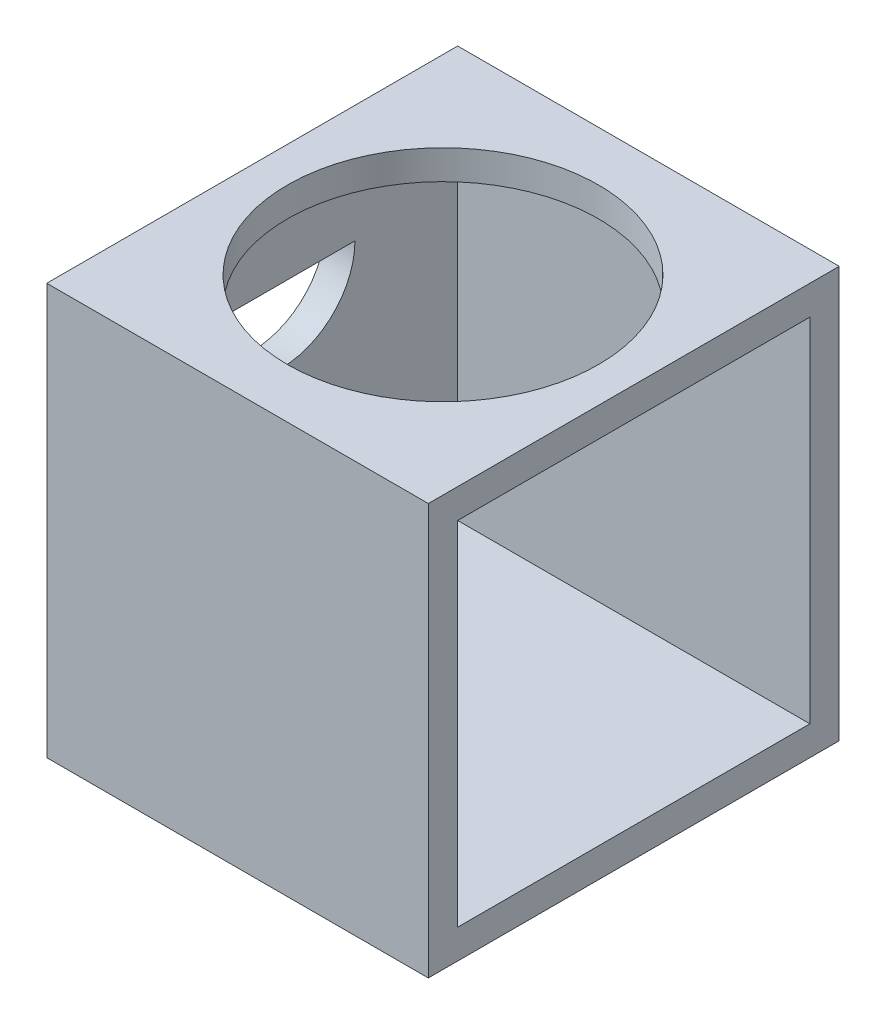
ISO-10303-21;
HEADER;
FILE_DESCRIPTION(('STEP AP214'),'2;1');
FILE_NAME('part.step','',(''),(''),'','','');
FILE_SCHEMA(('AUTOMOTIVE_DESIGN { 1 0 10303 214 1 1 1 1 }'));
ENDSEC;
DATA;
#1=APPLICATION_CONTEXT('core data for automotive mechanical design processes');
#2=APPLICATION_PROTOCOL_DEFINITION('international standard','automotive_design',2000,#1);
#3=PRODUCT_CONTEXT('',#1,'mechanical');
#4=PRODUCT('Part','Part','',(#3));
#5=PRODUCT_RELATED_PRODUCT_CATEGORY('part','',(#4));
#6=PRODUCT_DEFINITION_FORMATION('','',#4);
#7=PRODUCT_DEFINITION_CONTEXT('part definition',#1,'design');
#8=PRODUCT_DEFINITION('design','',#6,#7);
#9=PRODUCT_DEFINITION_SHAPE('','',#8);
#10=(LENGTH_UNIT() NAMED_UNIT(*) SI_UNIT(.MILLI.,.METRE.));
#11=(NAMED_UNIT(*) PLANE_ANGLE_UNIT() SI_UNIT($,.RADIAN.));
#12=(NAMED_UNIT(*) SI_UNIT($,.STERADIAN.) SOLID_ANGLE_UNIT());
#13=UNCERTAINTY_MEASURE_WITH_UNIT(LENGTH_MEASURE(1.E-05),#10,'distance_accuracy_value','');
#14=(GEOMETRIC_REPRESENTATION_CONTEXT(3) GLOBAL_UNCERTAINTY_ASSIGNED_CONTEXT((#13)) GLOBAL_UNIT_ASSIGNED_CONTEXT((#10,
#11,#12)) REPRESENTATION_CONTEXT('',''));
#15=CARTESIAN_POINT('',(0.,0.,0.));
#16=DIRECTION('',(0.,0.,1.));
#17=DIRECTION('',(1.,0.,0.));
#18=AXIS2_PLACEMENT_3D('',#15,#16,#17);
#19=CARTESIAN_POINT('',(0.,0.,0.));
#20=DIRECTION('',(-1.,0.,0.));
#21=DIRECTION('',(0.,0.,1.));
#22=AXIS2_PLACEMENT_3D('',#19,#20,#21);
#23=PLANE('',#22);
#24=DIRECTION('',(0.,0.,-1.));
#25=VECTOR('',#24,1.);
#26=CARTESIAN_POINT('',(0.,60.,60.));
#27=LINE('',#26,#25);
#28=CARTESIAN_POINT('',(0.,60.,60.));
#29=VERTEX_POINT('',#28);
#30=CARTESIAN_POINT('',(0.,60.,-60.));
#31=VERTEX_POINT('',#30);
#32=EDGE_CURVE('E188',#29,#31,#27,.T.);
#33=ORIENTED_EDGE('',*,*,#32,.F.);
#34=DIRECTION('',(0.,-1.,0.));
#35=VECTOR('',#34,1.);
#36=CARTESIAN_POINT('',(0.,60.,60.));
#37=LINE('',#36,#35);
#38=CARTESIAN_POINT('',(0.,-60.,60.));
#39=VERTEX_POINT('',#38);
#40=EDGE_CURVE('E175',#29,#39,#37,.T.);
#41=ORIENTED_EDGE('',*,*,#40,.T.);
#42=DIRECTION('',(0.,0.,-1.));
#43=VECTOR('',#42,1.);
#44=CARTESIAN_POINT('',(0.,-60.,60.));
#45=LINE('',#44,#43);
#46=CARTESIAN_POINT('',(0.,-60.,-60.));
#47=VERTEX_POINT('',#46);
#48=EDGE_CURVE('E171',#39,#47,#45,.T.);
#49=ORIENTED_EDGE('',*,*,#48,.T.);
#50=DIRECTION('',(0.,-1.,0.));
#51=VECTOR('',#50,1.);
#52=CARTESIAN_POINT('',(0.,60.,-60.));
#53=LINE('',#52,#51);
#54=EDGE_CURVE('E185',#31,#47,#53,.T.);
#55=ORIENTED_EDGE('',*,*,#54,.F.);
#56=EDGE_LOOP('',(#33,#41,#49,#55));
#57=FACE_BOUND('',#56,.T.);
#58=DIRECTION('',(0.,0.,-1.));
#59=VECTOR('',#58,1.);
#60=CARTESIAN_POINT('',(0.,40.,-25.));
#61=LINE('',#60,#59);
#62=CARTESIAN_POINT('',(0.,40.,25.));
#63=VERTEX_POINT('',#62);
#64=CARTESIAN_POINT('',(0.,40.,-25.));
#65=VERTEX_POINT('',#64);
#66=EDGE_CURVE('E77',#63,#65,#61,.T.);
#67=ORIENTED_EDGE('',*,*,#66,.T.);
#68=CARTESIAN_POINT('',(0.,40.,0.));
#69=DIRECTION('',(-1.,0.,0.));
#70=DIRECTION('',(0.,0.,1.));
#71=AXIS2_PLACEMENT_3D('',#68,#69,#70);
#72=CIRCLE('',#71,25.);
#73=EDGE_CURVE('E144',#63,#65,#72,.F.);
#74=ORIENTED_EDGE('',*,*,#73,.F.);
#75=EDGE_LOOP('',(#67,#74));
#76=FACE_BOUND('',#75,.T.);
#77=ADVANCED_FACE('F62',(#57,#76),#23,.F.);
#78=CARTESIAN_POINT('',(-10.,0.,0.));
#79=DIRECTION('',(-1.,0.,0.));
#80=DIRECTION('',(0.,0.,1.));
#81=AXIS2_PLACEMENT_3D('',#78,#79,#80);
#82=PLANE('',#81);
#83=DIRECTION('',(0.,-1.,0.));
#84=VECTOR('',#83,1.);
#85=CARTESIAN_POINT('',(-10.,70.,-70.));
#86=LINE('',#85,#84);
#87=CARTESIAN_POINT('',(-10.,70.,-70.));
#88=VERTEX_POINT('',#87);
#89=CARTESIAN_POINT('',(-10.,-70.,-70.));
#90=VERTEX_POINT('',#89);
#91=EDGE_CURVE('E159',#88,#90,#86,.T.);
#92=ORIENTED_EDGE('',*,*,#91,.T.);
#93=DIRECTION('',(0.,0.,1.));
#94=VECTOR('',#93,1.);
#95=CARTESIAN_POINT('',(-10.,-70.,-70.));
#96=LINE('',#95,#94);
#97=CARTESIAN_POINT('',(-10.,-70.,70.));
#98=VERTEX_POINT('',#97);
#99=EDGE_CURVE('E162',#90,#98,#96,.T.);
#100=ORIENTED_EDGE('',*,*,#99,.T.);
#101=DIRECTION('',(0.,1.,0.));
#102=VECTOR('',#101,1.);
#103=CARTESIAN_POINT('',(-10.,70.,70.));
#104=LINE('',#103,#102);
#105=CARTESIAN_POINT('',(-10.,70.,70.));
#106=VERTEX_POINT('',#105);
#107=EDGE_CURVE('E165',#98,#106,#104,.T.);
#108=ORIENTED_EDGE('',*,*,#107,.T.);
#109=DIRECTION('',(0.,0.,-1.));
#110=VECTOR('',#109,1.);
#111=CARTESIAN_POINT('',(-10.,70.,-70.));
#112=LINE('',#111,#110);
#113=EDGE_CURVE('E168',#106,#88,#112,.T.);
#114=ORIENTED_EDGE('',*,*,#113,.T.);
#115=EDGE_LOOP('',(#92,#100,#108,#114));
#116=FACE_BOUND('',#115,.T.);
#117=CARTESIAN_POINT('',(-10.,40.,0.));
#118=DIRECTION('',(-1.,0.,0.));
#119=DIRECTION('',(0.,0.,1.));
#120=AXIS2_PLACEMENT_3D('',#117,#118,#119);
#121=CIRCLE('',#120,25.);
#122=CARTESIAN_POINT('',(-9.99999999999999,40.,-25.));
#123=VERTEX_POINT('',#122);
#124=CARTESIAN_POINT('',(-10.,40.,25.));
#125=VERTEX_POINT('',#124);
#126=EDGE_CURVE('E141',#123,#125,#121,.T.);
#127=ORIENTED_EDGE('',*,*,#126,.F.);
#128=DIRECTION('',(0.,0.,1.));
#129=VECTOR('',#128,1.);
#130=CARTESIAN_POINT('',(-10.,40.,-25.));
#131=LINE('',#130,#129);
#132=EDGE_CURVE('E82',#123,#125,#131,.T.);
#133=ORIENTED_EDGE('',*,*,#132,.T.);
#134=EDGE_LOOP('',(#127,#133));
#135=FACE_BOUND('',#134,.T.);
#136=ADVANCED_FACE('F224',(#116,#135),#82,.T.);
#137=CARTESIAN_POINT('',(120.,0.,0.));
#138=DIRECTION('',(-1.,0.,0.));
#139=DIRECTION('',(0.,0.,1.));
#140=AXIS2_PLACEMENT_3D('',#137,#138,#139);
#141=PLANE('',#140);
#142=DIRECTION('',(0.,0.,-1.));
#143=VECTOR('',#142,1.);
#144=CARTESIAN_POINT('',(120.,-70.,0.));
#145=LINE('',#144,#143);
#146=CARTESIAN_POINT('',(120.,-70.,70.));
#147=VERTEX_POINT('',#146);
#148=CARTESIAN_POINT('',(120.,-70.,-70.));
#149=VERTEX_POINT('',#148);
#150=EDGE_CURVE('E203',#147,#149,#145,.T.);
#151=ORIENTED_EDGE('',*,*,#150,.T.);
#152=DIRECTION('',(0.,-1.,0.));
#153=VECTOR('',#152,1.);
#154=CARTESIAN_POINT('',(120.,0.,-70.));
#155=LINE('',#154,#153);
#156=CARTESIAN_POINT('',(120.,70.,-70.));
#157=VERTEX_POINT('',#156);
#158=EDGE_CURVE('E205',#157,#149,#155,.T.);
#159=ORIENTED_EDGE('',*,*,#158,.F.);
#160=DIRECTION('',(0.,0.,-1.));
#161=VECTOR('',#160,1.);
#162=CARTESIAN_POINT('',(120.,70.,0.));
#163=LINE('',#162,#161);
#164=CARTESIAN_POINT('',(120.,70.,70.));
#165=VERTEX_POINT('',#164);
#166=EDGE_CURVE('E208',#165,#157,#163,.T.);
#167=ORIENTED_EDGE('',*,*,#166,.F.);
#168=DIRECTION('',(0.,-1.,0.));
#169=VECTOR('',#168,1.);
#170=CARTESIAN_POINT('',(120.,0.,70.));
#171=LINE('',#170,#169);
#172=EDGE_CURVE('E211',#165,#147,#171,.T.);
#173=ORIENTED_EDGE('',*,*,#172,.T.);
#174=EDGE_LOOP('',(#151,#159,#167,#173));
#175=FACE_BOUND('',#174,.T.);
#176=DIRECTION('',(0.,0.,-1.));
#177=VECTOR('',#176,1.);
#178=CARTESIAN_POINT('',(120.,-60.,60.));
#179=LINE('',#178,#177);
#180=CARTESIAN_POINT('',(120.,-60.,60.));
#181=VERTEX_POINT('',#180);
#182=CARTESIAN_POINT('',(120.,-60.,-60.));
#183=VERTEX_POINT('',#182);
#184=EDGE_CURVE('E172',#181,#183,#179,.T.);
#185=ORIENTED_EDGE('',*,*,#184,.F.);
#186=DIRECTION('',(0.,-1.,0.));
#187=VECTOR('',#186,1.);
#188=CARTESIAN_POINT('',(120.,60.,60.));
#189=LINE('',#188,#187);
#190=CARTESIAN_POINT('',(120.,60.,60.));
#191=VERTEX_POINT('',#190);
#192=EDGE_CURVE('E181',#191,#181,#189,.T.);
#193=ORIENTED_EDGE('',*,*,#192,.F.);
#194=DIRECTION('',(0.,0.,-1.));
#195=VECTOR('',#194,1.);
#196=CARTESIAN_POINT('',(120.,60.,60.));
#197=LINE('',#196,#195);
#198=CARTESIAN_POINT('',(120.,60.,-60.));
#199=VERTEX_POINT('',#198);
#200=EDGE_CURVE('E178',#191,#199,#197,.T.);
#201=ORIENTED_EDGE('',*,*,#200,.T.);
#202=DIRECTION('',(0.,-1.,0.));
#203=VECTOR('',#202,1.);
#204=CARTESIAN_POINT('',(120.,60.,-60.));
#205=LINE('',#204,#203);
#206=EDGE_CURVE('E174',#199,#183,#205,.T.);
#207=ORIENTED_EDGE('',*,*,#206,.T.);
#208=EDGE_LOOP('',(#185,#193,#201,#207));
#209=FACE_BOUND('',#208,.T.);
#210=ADVANCED_FACE('F237',(#175,#209),#141,.F.);
#211=CARTESIAN_POINT('',(120.,-70.,0.));
#212=DIRECTION('',(0.,1.,0.));
#213=DIRECTION('',(0.,0.,1.));
#214=AXIS2_PLACEMENT_3D('',#211,#212,#213);
#215=PLANE('',#214);
#216=DIRECTION('',(-1.,0.,0.));
#217=VECTOR('',#216,1.);
#218=CARTESIAN_POINT('',(120.,-70.,70.));
#219=LINE('',#218,#217);
#220=EDGE_CURVE('E213',#147,#98,#219,.T.);
#221=ORIENTED_EDGE('',*,*,#220,.T.);
#222=ORIENTED_EDGE('',*,*,#99,.F.);
#223=DIRECTION('',(-1.,0.,0.));
#224=VECTOR('',#223,1.);
#225=CARTESIAN_POINT('',(120.,-70.,-70.));
#226=LINE('',#225,#224);
#227=EDGE_CURVE('E12',#149,#90,#226,.T.);
#228=ORIENTED_EDGE('',*,*,#227,.F.);
#229=ORIENTED_EDGE('',*,*,#150,.F.);
#230=EDGE_LOOP('',(#221,#222,#228,#229));
#231=FACE_BOUND('',#230,.T.);
#232=ADVANCED_FACE('F64',(#231),#215,.F.);
#233=CARTESIAN_POINT('',(120.,0.,-70.));
#234=DIRECTION('',(0.,0.,-1.));
#235=DIRECTION('',(0.,1.,0.));
#236=AXIS2_PLACEMENT_3D('',#233,#234,#235);
#237=PLANE('',#236);
#238=ORIENTED_EDGE('',*,*,#227,.T.);
#239=ORIENTED_EDGE('',*,*,#91,.F.);
#240=DIRECTION('',(-1.,0.,0.));
#241=VECTOR('',#240,1.);
#242=CARTESIAN_POINT('',(120.,70.,-70.));
#243=LINE('',#242,#241);
#244=EDGE_CURVE('E70',#157,#88,#243,.T.);
#245=ORIENTED_EDGE('',*,*,#244,.F.);
#246=ORIENTED_EDGE('',*,*,#158,.T.);
#247=EDGE_LOOP('',(#238,#239,#245,#246));
#248=FACE_BOUND('',#247,.T.);
#249=ADVANCED_FACE('F227',(#248),#237,.T.);
#250=CARTESIAN_POINT('',(120.,70.,0.));
#251=DIRECTION('',(0.,1.,0.));
#252=DIRECTION('',(0.,0.,1.));
#253=AXIS2_PLACEMENT_3D('',#250,#251,#252);
#254=PLANE('',#253);
#255=CARTESIAN_POINT('',(55.,70.,0.));
#256=DIRECTION('',(0.,1.,0.));
#257=DIRECTION('',(0.,0.,1.));
#258=AXIS2_PLACEMENT_3D('',#255,#256,#257);
#259=CIRCLE('',#258,53.);
#260=CARTESIAN_POINT('',(55.,70.,53.));
#261=VERTEX_POINT('',#260);
#262=EDGE_CURVE('E147',#261,#261,#259,.T.);
#263=ORIENTED_EDGE('',*,*,#262,.F.);
#264=EDGE_LOOP('',(#263));
#265=FACE_BOUND('',#264,.T.);
#266=ORIENTED_EDGE('',*,*,#244,.T.);
#267=ORIENTED_EDGE('',*,*,#113,.F.);
#268=DIRECTION('',(-1.,0.,0.));
#269=VECTOR('',#268,1.);
#270=CARTESIAN_POINT('',(120.,70.,70.));
#271=LINE('',#270,#269);
#272=EDGE_CURVE('E215',#165,#106,#271,.T.);
#273=ORIENTED_EDGE('',*,*,#272,.F.);
#274=ORIENTED_EDGE('',*,*,#166,.T.);
#275=EDGE_LOOP('',(#266,#267,#273,#274));
#276=FACE_BOUND('',#275,.T.);
#277=ADVANCED_FACE('F218',(#265,#276),#254,.T.);
#278=CARTESIAN_POINT('',(120.,0.,70.));
#279=DIRECTION('',(0.,0.,-1.));
#280=DIRECTION('',(0.,1.,0.));
#281=AXIS2_PLACEMENT_3D('',#278,#279,#280);
#282=PLANE('',#281);
#283=ORIENTED_EDGE('',*,*,#272,.T.);
#284=ORIENTED_EDGE('',*,*,#107,.F.);
#285=ORIENTED_EDGE('',*,*,#220,.F.);
#286=ORIENTED_EDGE('',*,*,#172,.F.);
#287=EDGE_LOOP('',(#283,#284,#285,#286));
#288=FACE_BOUND('',#287,.T.);
#289=ADVANCED_FACE('F234',(#288),#282,.F.);
#290=CARTESIAN_POINT('',(120.,-60.,60.));
#291=DIRECTION('',(0.,1.,0.));
#292=DIRECTION('',(0.,0.,1.));
#293=AXIS2_PLACEMENT_3D('',#290,#291,#292);
#294=PLANE('',#293);
#295=ORIENTED_EDGE('',*,*,#48,.F.);
#296=DIRECTION('',(-1.,0.,0.));
#297=VECTOR('',#296,1.);
#298=CARTESIAN_POINT('',(120.,-60.,60.));
#299=LINE('',#298,#297);
#300=EDGE_CURVE('E183',#181,#39,#299,.T.);
#301=ORIENTED_EDGE('',*,*,#300,.F.);
#302=ORIENTED_EDGE('',*,*,#184,.T.);
#303=DIRECTION('',(-1.,0.,0.));
#304=VECTOR('',#303,1.);
#305=CARTESIAN_POINT('',(120.,-60.,-60.));
#306=LINE('',#305,#304);
#307=EDGE_CURVE('E200',#183,#47,#306,.T.);
#308=ORIENTED_EDGE('',*,*,#307,.T.);
#309=EDGE_LOOP('',(#295,#301,#302,#308));
#310=FACE_BOUND('',#309,.T.);
#311=ADVANCED_FACE('F248',(#310),#294,.T.);
#312=CARTESIAN_POINT('',(120.,60.,-60.));
#313=DIRECTION('',(0.,0.,-1.));
#314=DIRECTION('',(0.,1.,0.));
#315=AXIS2_PLACEMENT_3D('',#312,#313,#314);
#316=PLANE('',#315);
#317=ORIENTED_EDGE('',*,*,#54,.T.);
#318=ORIENTED_EDGE('',*,*,#307,.F.);
#319=ORIENTED_EDGE('',*,*,#206,.F.);
#320=DIRECTION('',(-1.,0.,0.));
#321=VECTOR('',#320,1.);
#322=CARTESIAN_POINT('',(120.,60.,-60.));
#323=LINE('',#322,#321);
#324=EDGE_CURVE('E197',#199,#31,#323,.T.);
#325=ORIENTED_EDGE('',*,*,#324,.T.);
#326=EDGE_LOOP('',(#317,#318,#319,#325));
#327=FACE_BOUND('',#326,.T.);
#328=ADVANCED_FACE('F250',(#327),#316,.F.);
#329=CARTESIAN_POINT('',(120.,60.,60.));
#330=DIRECTION('',(0.,1.,0.));
#331=DIRECTION('',(0.,0.,1.));
#332=AXIS2_PLACEMENT_3D('',#329,#330,#331);
#333=PLANE('',#332);
#334=CARTESIAN_POINT('',(55.,60.,0.));
#335=DIRECTION('',(0.,1.,0.));
#336=DIRECTION('',(0.,0.,1.));
#337=AXIS2_PLACEMENT_3D('',#334,#335,#336);
#338=CIRCLE('',#337,53.);
#339=CARTESIAN_POINT('',(55.,60.,53.));
#340=VERTEX_POINT('',#339);
#341=EDGE_CURVE('E156',#340,#340,#338,.F.);
#342=ORIENTED_EDGE('',*,*,#341,.F.);
#343=EDGE_LOOP('',(#342));
#344=FACE_BOUND('',#343,.T.);
#345=ORIENTED_EDGE('',*,*,#32,.T.);
#346=ORIENTED_EDGE('',*,*,#324,.F.);
#347=ORIENTED_EDGE('',*,*,#200,.F.);
#348=DIRECTION('',(-1.,0.,0.));
#349=VECTOR('',#348,1.);
#350=CARTESIAN_POINT('',(120.,60.,60.));
#351=LINE('',#350,#349);
#352=EDGE_CURVE('E194',#191,#29,#351,.T.);
#353=ORIENTED_EDGE('',*,*,#352,.T.);
#354=EDGE_LOOP('',(#345,#346,#347,#353));
#355=FACE_BOUND('',#354,.T.);
#356=ADVANCED_FACE('F257',(#344,#355),#333,.F.);
#357=CARTESIAN_POINT('',(120.,60.,60.));
#358=DIRECTION('',(0.,0.,-1.));
#359=DIRECTION('',(0.,1.,0.));
#360=AXIS2_PLACEMENT_3D('',#357,#358,#359);
#361=PLANE('',#360);
#362=ORIENTED_EDGE('',*,*,#40,.F.);
#363=ORIENTED_EDGE('',*,*,#352,.F.);
#364=ORIENTED_EDGE('',*,*,#192,.T.);
#365=ORIENTED_EDGE('',*,*,#300,.T.);
#366=EDGE_LOOP('',(#362,#363,#364,#365));
#367=FACE_BOUND('',#366,.T.);
#368=ADVANCED_FACE('F254',(#367),#361,.T.);
#369=CARTESIAN_POINT('',(55.,-70.001,0.));
#370=DIRECTION('',(0.,1.,0.));
#371=DIRECTION('',(0.,0.,1.));
#372=AXIS2_PLACEMENT_3D('',#369,#370,#371);
#373=CYLINDRICAL_SURFACE('',#372,53.);
#374=ORIENTED_EDGE('',*,*,#262,.T.);
#375=EDGE_LOOP('',(#374));
#376=FACE_BOUND('',#375,.T.);
#377=ORIENTED_EDGE('',*,*,#341,.T.);
#378=EDGE_LOOP('',(#377));
#379=FACE_BOUND('',#378,.T.);
#380=ADVANCED_FACE('F265',(#376,#379),#373,.F.);
#381=CARTESIAN_POINT('',(120.001,40.,-25.));
#382=DIRECTION('',(0.,-1.,0.));
#383=DIRECTION('',(0.,0.,-1.));
#384=AXIS2_PLACEMENT_3D('',#381,#382,#383);
#385=PLANE('',#384);
#386=DIRECTION('',(-1.,0.,0.));
#387=VECTOR('',#386,1.);
#388=CARTESIAN_POINT('',(120.001,40.,25.));
#389=LINE('',#388,#387);
#390=EDGE_CURVE('E140',#63,#125,#389,.T.);
#391=ORIENTED_EDGE('',*,*,#390,.T.);
#392=ORIENTED_EDGE('',*,*,#132,.F.);
#393=DIRECTION('',(-1.,0.,0.));
#394=VECTOR('',#393,1.);
#395=CARTESIAN_POINT('',(120.001,40.,-25.));
#396=LINE('',#395,#394);
#397=EDGE_CURVE('E134',#65,#123,#396,.T.);
#398=ORIENTED_EDGE('',*,*,#397,.F.);
#399=ORIENTED_EDGE('',*,*,#66,.F.);
#400=EDGE_LOOP('',(#391,#392,#398,#399));
#401=FACE_BOUND('',#400,.T.);
#402=ADVANCED_FACE('F136',(#401),#385,.T.);
#403=CARTESIAN_POINT('',(120.001,40.,0.));
#404=DIRECTION('',(-1.,0.,0.));
#405=DIRECTION('',(0.,0.,1.));
#406=AXIS2_PLACEMENT_3D('',#403,#404,#405);
#407=CYLINDRICAL_SURFACE('',#406,25.);
#408=ORIENTED_EDGE('',*,*,#73,.T.);
#409=ORIENTED_EDGE('',*,*,#397,.T.);
#410=ORIENTED_EDGE('',*,*,#126,.T.);
#411=ORIENTED_EDGE('',*,*,#390,.F.);
#412=EDGE_LOOP('',(#408,#409,#410,#411));
#413=FACE_BOUND('',#412,.T.);
#414=ADVANCED_FACE('F145',(#413),#407,.F.);
#415=CLOSED_SHELL('',(#77,#136,#210,#232,#249,#277,#289,#311,#328,#356,#368,#380,#402,#414));
#416=MANIFOLD_SOLID_BREP('B2',#415);
#417=ADVANCED_BREP_SHAPE_REPRESENTATION('',(#18,#416),#14);
#418=SHAPE_DEFINITION_REPRESENTATION(#9,#417);
ENDSEC;
END-ISO-10303-21;
